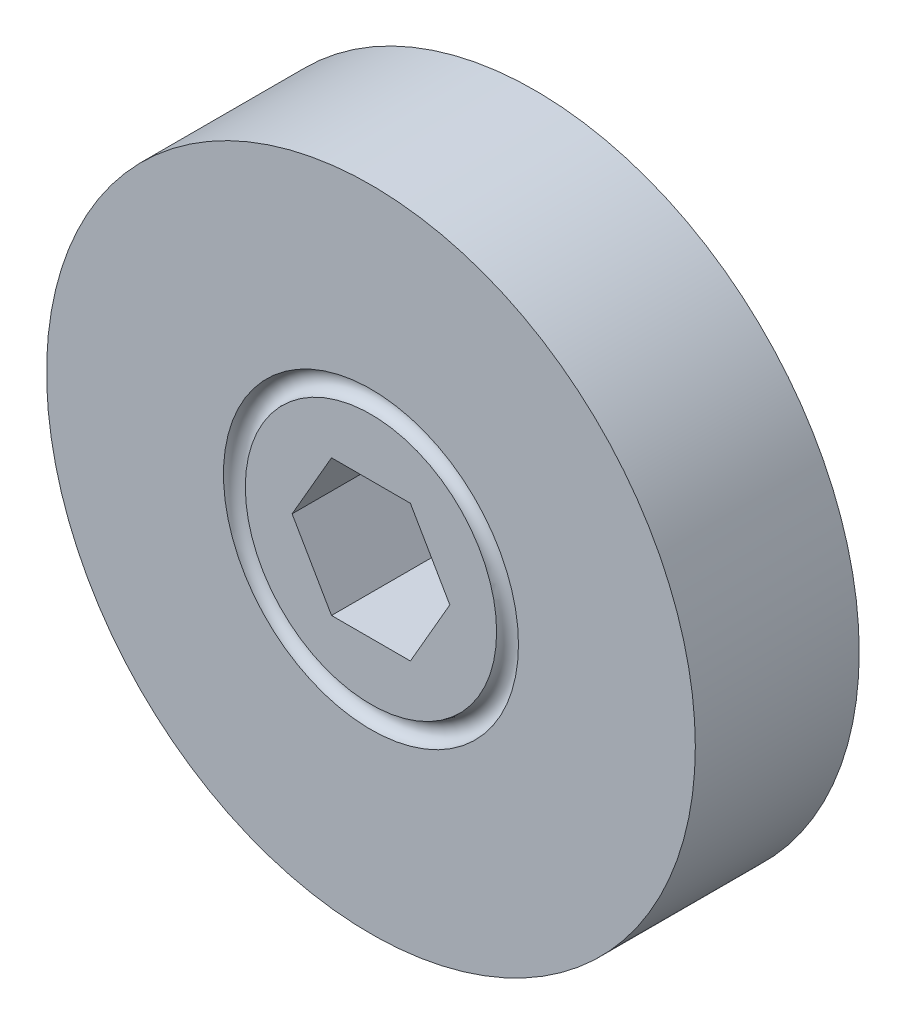
ISO-10303-21;
HEADER;
FILE_DESCRIPTION(('STEP AP214'),'2;1');
FILE_NAME('part.step','',(''),(''),'','','');
FILE_SCHEMA(('AUTOMOTIVE_DESIGN { 1 0 10303 214 1 1 1 1 }'));
ENDSEC;
DATA;
#1=APPLICATION_CONTEXT('core data for automotive mechanical design processes');
#2=APPLICATION_PROTOCOL_DEFINITION('international standard','automotive_design',2000,#1);
#3=PRODUCT_CONTEXT('',#1,'mechanical');
#4=PRODUCT('Part','Part','',(#3));
#5=PRODUCT_RELATED_PRODUCT_CATEGORY('part','',(#4));
#6=PRODUCT_DEFINITION_FORMATION('','',#4);
#7=PRODUCT_DEFINITION_CONTEXT('part definition',#1,'design');
#8=PRODUCT_DEFINITION('design','',#6,#7);
#9=PRODUCT_DEFINITION_SHAPE('','',#8);
#10=(LENGTH_UNIT() NAMED_UNIT(*) SI_UNIT(.MILLI.,.METRE.));
#11=(NAMED_UNIT(*) PLANE_ANGLE_UNIT() SI_UNIT($,.RADIAN.));
#12=(NAMED_UNIT(*) SI_UNIT($,.STERADIAN.) SOLID_ANGLE_UNIT());
#13=UNCERTAINTY_MEASURE_WITH_UNIT(LENGTH_MEASURE(1.E-05),#10,'distance_accuracy_value','');
#14=(GEOMETRIC_REPRESENTATION_CONTEXT(3) GLOBAL_UNCERTAINTY_ASSIGNED_CONTEXT((#13)) GLOBAL_UNIT_ASSIGNED_CONTEXT((#10,
#11,#12)) REPRESENTATION_CONTEXT('',''));
#15=CARTESIAN_POINT('',(0.,0.,0.));
#16=DIRECTION('',(0.,0.,1.));
#17=DIRECTION('',(1.,0.,0.));
#18=AXIS2_PLACEMENT_3D('',#15,#16,#17);
#19=CARTESIAN_POINT('',(0.,30.1625,-7.62));
#20=DIRECTION('',(0.,0.,1.));
#21=DIRECTION('',(1.,0.,0.));
#22=AXIS2_PLACEMENT_3D('',#19,#20,#21);
#23=PLANE('',#22);
#24=CARTESIAN_POINT('',(0.,0.,-7.62));
#25=DIRECTION('',(0.,0.,1.));
#26=DIRECTION('',(1.,0.,0.));
#27=AXIS2_PLACEMENT_3D('',#24,#25,#26);
#28=CIRCLE('',#27,30.1625);
#29=CARTESIAN_POINT('',(30.1625,0.,-7.62));
#30=VERTEX_POINT('',#29);
#31=EDGE_CURVE('E11',#30,#30,#28,.T.);
#32=ORIENTED_EDGE('',*,*,#31,.F.);
#33=EDGE_LOOP('',(#32));
#34=FACE_BOUND('',#33,.T.);
#35=CARTESIAN_POINT('',(0.,0.,-7.62));
#36=DIRECTION('',(0.,0.,1.));
#37=DIRECTION('',(1.,0.,0.));
#38=AXIS2_PLACEMENT_3D('',#35,#36,#37);
#39=CIRCLE('',#38,13.716);
#40=CARTESIAN_POINT('',(13.716,0.,-7.62));
#41=VERTEX_POINT('',#40);
#42=EDGE_CURVE('E99',#41,#41,#39,.T.);
#43=ORIENTED_EDGE('',*,*,#42,.T.);
#44=EDGE_LOOP('',(#43));
#45=FACE_BOUND('',#44,.T.);
#46=ADVANCED_FACE('F33',(#34,#45),#23,.F.);
#47=CARTESIAN_POINT('',(0.,0.,7.62));
#48=DIRECTION('',(0.,0.,1.));
#49=DIRECTION('',(1.,0.,0.));
#50=AXIS2_PLACEMENT_3D('',#47,#48,#49);
#51=CYLINDRICAL_SURFACE('',#50,30.1625);
#52=CARTESIAN_POINT('',(0.,0.,7.62));
#53=DIRECTION('',(0.,0.,1.));
#54=DIRECTION('',(1.,0.,0.));
#55=AXIS2_PLACEMENT_3D('',#52,#53,#54);
#56=CIRCLE('',#55,30.1625);
#57=CARTESIAN_POINT('',(30.1625,0.,7.62));
#58=VERTEX_POINT('',#57);
#59=EDGE_CURVE('E40',#58,#58,#56,.T.);
#60=ORIENTED_EDGE('',*,*,#59,.F.);
#61=EDGE_LOOP('',(#60));
#62=FACE_BOUND('',#61,.T.);
#63=ORIENTED_EDGE('',*,*,#31,.T.);
#64=EDGE_LOOP('',(#63));
#65=FACE_BOUND('',#64,.T.);
#66=ADVANCED_FACE('F149',(#62,#65),#51,.T.);
#67=CARTESIAN_POINT('',(0.,30.1625,7.62));
#68=DIRECTION('',(0.,0.,-1.));
#69=DIRECTION('',(-1.,0.,0.));
#70=AXIS2_PLACEMENT_3D('',#67,#68,#69);
#71=PLANE('',#70);
#72=CARTESIAN_POINT('',(0.,0.,7.62));
#73=DIRECTION('',(0.,0.,1.));
#74=DIRECTION('',(1.,0.,0.));
#75=AXIS2_PLACEMENT_3D('',#72,#73,#74);
#76=CIRCLE('',#75,13.716);
#77=CARTESIAN_POINT('',(13.716,0.,7.62));
#78=VERTEX_POINT('',#77);
#79=EDGE_CURVE('E142',#78,#78,#76,.T.);
#80=ORIENTED_EDGE('',*,*,#79,.F.);
#81=EDGE_LOOP('',(#80));
#82=FACE_BOUND('',#81,.T.);
#83=ORIENTED_EDGE('',*,*,#59,.T.);
#84=EDGE_LOOP('',(#83));
#85=FACE_BOUND('',#84,.T.);
#86=ADVANCED_FACE('F147',(#82,#85),#71,.F.);
#87=CARTESIAN_POINT('',(0.,0.,7.62000000000001));
#88=DIRECTION('',(0.,0.,1.));
#89=DIRECTION('',(1.,0.,0.));
#90=AXIS2_PLACEMENT_3D('',#87,#88,#89);
#91=TOROIDAL_SURFACE('',#90,12.7,1.016);
#92=CARTESIAN_POINT('',(0.,0.,7.62));
#93=DIRECTION('',(0.,0.,1.));
#94=DIRECTION('',(1.,0.,0.));
#95=AXIS2_PLACEMENT_3D('',#92,#93,#94);
#96=CIRCLE('',#95,11.684);
#97=CARTESIAN_POINT('',(11.684,0.,7.62));
#98=VERTEX_POINT('',#97);
#99=EDGE_CURVE('E139',#98,#98,#96,.T.);
#100=ORIENTED_EDGE('',*,*,#99,.F.);
#101=EDGE_LOOP('',(#100));
#102=FACE_BOUND('',#101,.T.);
#103=ORIENTED_EDGE('',*,*,#79,.T.);
#104=EDGE_LOOP('',(#103));
#105=FACE_BOUND('',#104,.T.);
#106=ADVANCED_FACE('F169',(#102,#105),#91,.F.);
#107=CARTESIAN_POINT('',(0.,11.684,7.62));
#108=DIRECTION('',(0.,0.,-1.));
#109=DIRECTION('',(-1.,0.,0.));
#110=AXIS2_PLACEMENT_3D('',#107,#108,#109);
#111=PLANE('',#110);
#112=DIRECTION('',(-0.5,-0.866025403784439,0.));
#113=VECTOR('',#112,1.);
#114=CARTESIAN_POINT('',(-3.66617420935412,6.35,7.62));
#115=LINE('',#114,#113);
#116=CARTESIAN_POINT('',(-3.66617420935412,6.35,7.62));
#117=VERTEX_POINT('',#116);
#118=CARTESIAN_POINT('',(-7.33234841870825,0.,7.62));
#119=VERTEX_POINT('',#118);
#120=EDGE_CURVE('E108',#117,#119,#115,.T.);
#121=ORIENTED_EDGE('',*,*,#120,.F.);
#122=DIRECTION('',(-1.,0.,0.));
#123=VECTOR('',#122,1.);
#124=CARTESIAN_POINT('',(3.66617420935412,6.35,7.62));
#125=LINE('',#124,#123);
#126=CARTESIAN_POINT('',(3.66617420935412,6.35,7.62));
#127=VERTEX_POINT('',#126);
#128=EDGE_CURVE('E47',#127,#117,#125,.T.);
#129=ORIENTED_EDGE('',*,*,#128,.F.);
#130=DIRECTION('',(-0.5,0.866025403784439,0.));
#131=VECTOR('',#130,1.);
#132=CARTESIAN_POINT('',(7.33234841870825,0.,7.62));
#133=LINE('',#132,#131);
#134=CARTESIAN_POINT('',(7.33234841870825,0.,7.62));
#135=VERTEX_POINT('',#134);
#136=EDGE_CURVE('E93',#135,#127,#133,.T.);
#137=ORIENTED_EDGE('',*,*,#136,.F.);
#138=DIRECTION('',(0.5,0.866025403784439,0.));
#139=VECTOR('',#138,1.);
#140=CARTESIAN_POINT('',(3.66617420935412,-6.35,7.62));
#141=LINE('',#140,#139);
#142=CARTESIAN_POINT('',(3.66617420935412,-6.35,7.62));
#143=VERTEX_POINT('',#142);
#144=EDGE_CURVE('E121',#143,#135,#141,.T.);
#145=ORIENTED_EDGE('',*,*,#144,.F.);
#146=DIRECTION('',(1.,0.,0.));
#147=VECTOR('',#146,1.);
#148=CARTESIAN_POINT('',(-3.66617420935413,-6.35,7.62));
#149=LINE('',#148,#147);
#150=CARTESIAN_POINT('',(-3.66617420935413,-6.35,7.62));
#151=VERTEX_POINT('',#150);
#152=EDGE_CURVE('E118',#151,#143,#149,.T.);
#153=ORIENTED_EDGE('',*,*,#152,.F.);
#154=DIRECTION('',(0.5,-0.866025403784439,0.));
#155=VECTOR('',#154,1.);
#156=CARTESIAN_POINT('',(-7.33234841870825,0.,7.62));
#157=LINE('',#156,#155);
#158=EDGE_CURVE('E115',#119,#151,#157,.T.);
#159=ORIENTED_EDGE('',*,*,#158,.F.);
#160=EDGE_LOOP('',(#121,#129,#137,#145,#153,#159));
#161=FACE_BOUND('',#160,.T.);
#162=ORIENTED_EDGE('',*,*,#99,.T.);
#163=EDGE_LOOP('',(#162));
#164=FACE_BOUND('',#163,.T.);
#165=ADVANCED_FACE('F164',(#161,#164),#111,.F.);
#166=CARTESIAN_POINT('',(0.,11.684,-7.62));
#167=DIRECTION('',(0.,0.,1.));
#168=DIRECTION('',(1.,0.,0.));
#169=AXIS2_PLACEMENT_3D('',#166,#167,#168);
#170=PLANE('',#169);
#171=DIRECTION('',(0.5,-0.866025403784439,0.));
#172=VECTOR('',#171,1.);
#173=CARTESIAN_POINT('',(7.33234841870825,0.,-7.62));
#174=LINE('',#173,#172);
#175=CARTESIAN_POINT('',(3.66617420935412,6.35,-7.62));
#176=VERTEX_POINT('',#175);
#177=CARTESIAN_POINT('',(7.33234841870825,0.,-7.62));
#178=VERTEX_POINT('',#177);
#179=EDGE_CURVE('E106',#176,#178,#174,.T.);
#180=ORIENTED_EDGE('',*,*,#179,.F.);
#181=DIRECTION('',(1.,0.,0.));
#182=VECTOR('',#181,1.);
#183=CARTESIAN_POINT('',(3.66617420935412,6.35,-7.62));
#184=LINE('',#183,#182);
#185=CARTESIAN_POINT('',(-3.66617420935412,6.35,-7.62));
#186=VERTEX_POINT('',#185);
#187=EDGE_CURVE('E87',#186,#176,#184,.T.);
#188=ORIENTED_EDGE('',*,*,#187,.F.);
#189=DIRECTION('',(0.5,0.866025403784439,0.));
#190=VECTOR('',#189,1.);
#191=CARTESIAN_POINT('',(-3.66617420935412,6.35,-7.62));
#192=LINE('',#191,#190);
#193=CARTESIAN_POINT('',(-7.33234841870825,0.,-7.62));
#194=VERTEX_POINT('',#193);
#195=EDGE_CURVE('E96',#194,#186,#192,.T.);
#196=ORIENTED_EDGE('',*,*,#195,.F.);
#197=DIRECTION('',(-0.5,0.866025403784439,0.));
#198=VECTOR('',#197,1.);
#199=CARTESIAN_POINT('',(-7.33234841870825,0.,-7.62));
#200=LINE('',#199,#198);
#201=CARTESIAN_POINT('',(-3.66617420935413,-6.35,-7.62));
#202=VERTEX_POINT('',#201);
#203=EDGE_CURVE('E55',#202,#194,#200,.T.);
#204=ORIENTED_EDGE('',*,*,#203,.F.);
#205=DIRECTION('',(-1.,0.,0.));
#206=VECTOR('',#205,1.);
#207=CARTESIAN_POINT('',(-3.66617420935413,-6.35,-7.62));
#208=LINE('',#207,#206);
#209=CARTESIAN_POINT('',(3.66617420935412,-6.35,-7.62));
#210=VERTEX_POINT('',#209);
#211=EDGE_CURVE('E260',#210,#202,#208,.T.);
#212=ORIENTED_EDGE('',*,*,#211,.F.);
#213=DIRECTION('',(-0.5,-0.866025403784439,0.));
#214=VECTOR('',#213,1.);
#215=CARTESIAN_POINT('',(3.66617420935412,-6.35,-7.62));
#216=LINE('',#215,#214);
#217=EDGE_CURVE('E110',#178,#210,#216,.T.);
#218=ORIENTED_EDGE('',*,*,#217,.F.);
#219=EDGE_LOOP('',(#180,#188,#196,#204,#212,#218));
#220=FACE_BOUND('',#219,.T.);
#221=CARTESIAN_POINT('',(0.,0.,-7.62));
#222=DIRECTION('',(0.,0.,1.));
#223=DIRECTION('',(1.,0.,0.));
#224=AXIS2_PLACEMENT_3D('',#221,#222,#223);
#225=CIRCLE('',#224,11.684);
#226=CARTESIAN_POINT('',(11.684,0.,-7.62));
#227=VERTEX_POINT('',#226);
#228=EDGE_CURVE('E136',#227,#227,#225,.T.);
#229=ORIENTED_EDGE('',*,*,#228,.F.);
#230=EDGE_LOOP('',(#229));
#231=FACE_BOUND('',#230,.T.);
#232=ADVANCED_FACE('F102',(#220,#231),#170,.F.);
#233=CARTESIAN_POINT('',(0.,0.,-7.62000000000001));
#234=DIRECTION('',(0.,0.,1.));
#235=DIRECTION('',(1.,0.,0.));
#236=AXIS2_PLACEMENT_3D('',#233,#234,#235);
#237=TOROIDAL_SURFACE('',#236,12.7,1.016);
#238=ORIENTED_EDGE('',*,*,#42,.F.);
#239=EDGE_LOOP('',(#238));
#240=FACE_BOUND('',#239,.T.);
#241=ORIENTED_EDGE('',*,*,#228,.T.);
#242=EDGE_LOOP('',(#241));
#243=FACE_BOUND('',#242,.T.);
#244=ADVANCED_FACE('F158',(#240,#243),#237,.F.);
#245=CARTESIAN_POINT('',(3.66617420935412,6.35,-7.621));
#246=DIRECTION('',(0.,1.,0.));
#247=DIRECTION('',(0.,0.,1.));
#248=AXIS2_PLACEMENT_3D('',#245,#246,#247);
#249=PLANE('',#248);
#250=ORIENTED_EDGE('',*,*,#187,.T.);
#251=DIRECTION('',(0.,0.,1.));
#252=VECTOR('',#251,1.);
#253=CARTESIAN_POINT('',(3.66617420935412,6.35,-7.621));
#254=LINE('',#253,#252);
#255=EDGE_CURVE('E100',#176,#127,#254,.T.);
#256=ORIENTED_EDGE('',*,*,#255,.T.);
#257=ORIENTED_EDGE('',*,*,#128,.T.);
#258=DIRECTION('',(0.,0.,1.));
#259=VECTOR('',#258,1.);
#260=CARTESIAN_POINT('',(-3.66617420935412,6.35,-7.621));
#261=LINE('',#260,#259);
#262=EDGE_CURVE('E83',#186,#117,#261,.T.);
#263=ORIENTED_EDGE('',*,*,#262,.F.);
#264=EDGE_LOOP('',(#250,#256,#257,#263));
#265=FACE_BOUND('',#264,.T.);
#266=ADVANCED_FACE('F85',(#265),#249,.F.);
#267=CARTESIAN_POINT('',(7.33234841870825,0.,-7.621));
#268=DIRECTION('',(0.866025403784439,0.5,0.));
#269=DIRECTION('',(-0.5,0.866025403784439,0.));
#270=AXIS2_PLACEMENT_3D('',#267,#268,#269);
#271=PLANE('',#270);
#272=ORIENTED_EDGE('',*,*,#179,.T.);
#273=DIRECTION('',(0.,0.,1.));
#274=VECTOR('',#273,1.);
#275=CARTESIAN_POINT('',(7.33234841870825,0.,-7.621));
#276=LINE('',#275,#274);
#277=EDGE_CURVE('E127',#178,#135,#276,.T.);
#278=ORIENTED_EDGE('',*,*,#277,.T.);
#279=ORIENTED_EDGE('',*,*,#136,.T.);
#280=ORIENTED_EDGE('',*,*,#255,.F.);
#281=EDGE_LOOP('',(#272,#278,#279,#280));
#282=FACE_BOUND('',#281,.T.);
#283=ADVANCED_FACE('F209',(#282),#271,.F.);
#284=CARTESIAN_POINT('',(3.66617420935412,-6.35,-7.621));
#285=DIRECTION('',(0.866025403784439,-0.5,0.));
#286=DIRECTION('',(0.5,0.866025403784439,0.));
#287=AXIS2_PLACEMENT_3D('',#284,#285,#286);
#288=PLANE('',#287);
#289=ORIENTED_EDGE('',*,*,#217,.T.);
#290=DIRECTION('',(0.,0.,1.));
#291=VECTOR('',#290,1.);
#292=CARTESIAN_POINT('',(3.66617420935412,-6.35,-7.621));
#293=LINE('',#292,#291);
#294=EDGE_CURVE('E129',#210,#143,#293,.T.);
#295=ORIENTED_EDGE('',*,*,#294,.T.);
#296=ORIENTED_EDGE('',*,*,#144,.T.);
#297=ORIENTED_EDGE('',*,*,#277,.F.);
#298=EDGE_LOOP('',(#289,#295,#296,#297));
#299=FACE_BOUND('',#298,.T.);
#300=ADVANCED_FACE('F217',(#299),#288,.F.);
#301=CARTESIAN_POINT('',(-3.66617420935413,-6.35,-7.621));
#302=DIRECTION('',(0.,-1.,0.));
#303=DIRECTION('',(0.,0.,-1.));
#304=AXIS2_PLACEMENT_3D('',#301,#302,#303);
#305=PLANE('',#304);
#306=ORIENTED_EDGE('',*,*,#211,.T.);
#307=DIRECTION('',(0.,0.,1.));
#308=VECTOR('',#307,1.);
#309=CARTESIAN_POINT('',(-3.66617420935413,-6.35,-7.621));
#310=LINE('',#309,#308);
#311=EDGE_CURVE('E131',#202,#151,#310,.T.);
#312=ORIENTED_EDGE('',*,*,#311,.T.);
#313=ORIENTED_EDGE('',*,*,#152,.T.);
#314=ORIENTED_EDGE('',*,*,#294,.F.);
#315=EDGE_LOOP('',(#306,#312,#313,#314));
#316=FACE_BOUND('',#315,.T.);
#317=ADVANCED_FACE('F227',(#316),#305,.F.);
#318=CARTESIAN_POINT('',(-7.33234841870825,0.,-7.621));
#319=DIRECTION('',(-0.866025403784439,-0.5,0.));
#320=DIRECTION('',(0.5,-0.866025403784439,0.));
#321=AXIS2_PLACEMENT_3D('',#318,#319,#320);
#322=PLANE('',#321);
#323=ORIENTED_EDGE('',*,*,#203,.T.);
#324=DIRECTION('',(0.,0.,1.));
#325=VECTOR('',#324,1.);
#326=CARTESIAN_POINT('',(-7.33234841870825,0.,-7.621));
#327=LINE('',#326,#325);
#328=EDGE_CURVE('E92',#194,#119,#327,.T.);
#329=ORIENTED_EDGE('',*,*,#328,.T.);
#330=ORIENTED_EDGE('',*,*,#158,.T.);
#331=ORIENTED_EDGE('',*,*,#311,.F.);
#332=EDGE_LOOP('',(#323,#329,#330,#331));
#333=FACE_BOUND('',#332,.T.);
#334=ADVANCED_FACE('F237',(#333),#322,.F.);
#335=CARTESIAN_POINT('',(-3.66617420935412,6.35,-7.621));
#336=DIRECTION('',(-0.866025403784439,0.5,0.));
#337=DIRECTION('',(-0.5,-0.866025403784439,0.));
#338=AXIS2_PLACEMENT_3D('',#335,#336,#337);
#339=PLANE('',#338);
#340=ORIENTED_EDGE('',*,*,#195,.T.);
#341=ORIENTED_EDGE('',*,*,#262,.T.);
#342=ORIENTED_EDGE('',*,*,#120,.T.);
#343=ORIENTED_EDGE('',*,*,#328,.F.);
#344=EDGE_LOOP('',(#340,#341,#342,#343));
#345=FACE_BOUND('',#344,.T.);
#346=ADVANCED_FACE('F97',(#345),#339,.F.);
#347=CLOSED_SHELL('',(#46,#66,#86,#106,#165,#232,#244,#266,#283,#300,#317,#334,#346));
#348=MANIFOLD_SOLID_BREP('B2',#347);
#349=ADVANCED_BREP_SHAPE_REPRESENTATION('',(#18,#348),#14);
#350=SHAPE_DEFINITION_REPRESENTATION(#9,#349);
ENDSEC;
END-ISO-10303-21;
